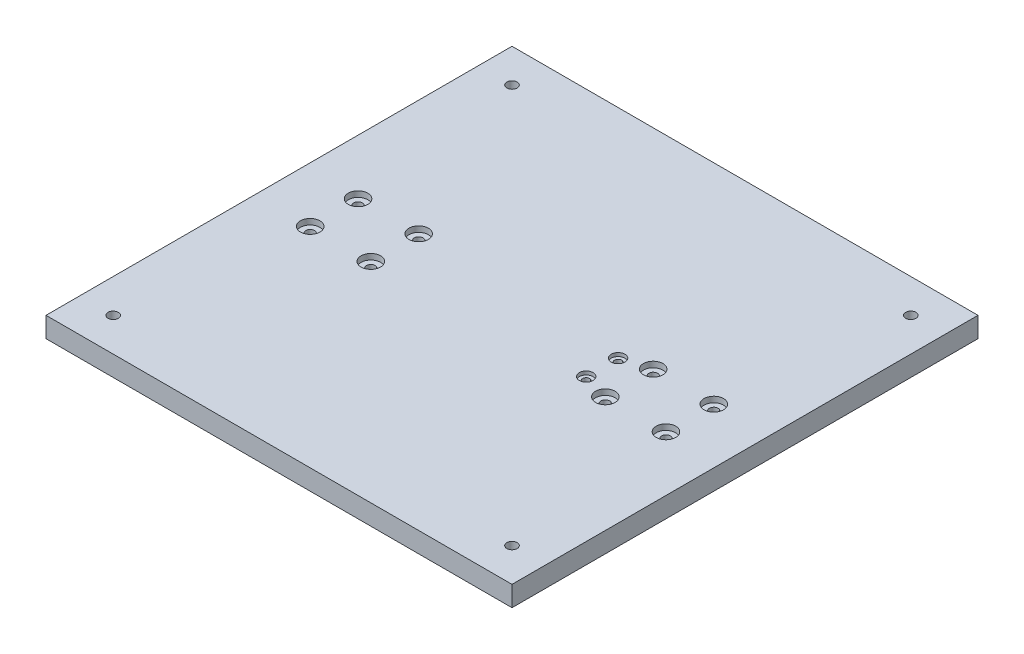
ISO-10303-21;
HEADER;
FILE_DESCRIPTION(('STEP AP214'),'2;1');
FILE_NAME('part.step','',(''),(''),'','','');
FILE_SCHEMA(('AUTOMOTIVE_DESIGN { 1 0 10303 214 1 1 1 1 }'));
ENDSEC;
DATA;
#1=APPLICATION_CONTEXT('core data for automotive mechanical design processes');
#2=APPLICATION_PROTOCOL_DEFINITION('international standard','automotive_design',2000,#1);
#3=PRODUCT_CONTEXT('',#1,'mechanical');
#4=PRODUCT('Part','Part','',(#3));
#5=PRODUCT_RELATED_PRODUCT_CATEGORY('part','',(#4));
#6=PRODUCT_DEFINITION_FORMATION('','',#4);
#7=PRODUCT_DEFINITION_CONTEXT('part definition',#1,'design');
#8=PRODUCT_DEFINITION('design','',#6,#7);
#9=PRODUCT_DEFINITION_SHAPE('','',#8);
#10=(LENGTH_UNIT() NAMED_UNIT(*) SI_UNIT(.MILLI.,.METRE.));
#11=(NAMED_UNIT(*) PLANE_ANGLE_UNIT() SI_UNIT($,.RADIAN.));
#12=(NAMED_UNIT(*) SI_UNIT($,.STERADIAN.) SOLID_ANGLE_UNIT());
#13=UNCERTAINTY_MEASURE_WITH_UNIT(LENGTH_MEASURE(1.E-05),#10,'distance_accuracy_value','');
#14=(GEOMETRIC_REPRESENTATION_CONTEXT(3) GLOBAL_UNCERTAINTY_ASSIGNED_CONTEXT((#13)) GLOBAL_UNIT_ASSIGNED_CONTEXT((#10,
#11,#12)) REPRESENTATION_CONTEXT('',''));
#15=CARTESIAN_POINT('',(0.,0.,0.));
#16=DIRECTION('',(0.,0.,1.));
#17=DIRECTION('',(1.,0.,0.));
#18=AXIS2_PLACEMENT_3D('',#15,#16,#17);
#19=CARTESIAN_POINT('',(0.,12.7,0.));
#20=DIRECTION('',(0.,-1.,0.));
#21=DIRECTION('',(0.,0.,-1.));
#22=AXIS2_PLACEMENT_3D('',#19,#20,#21);
#23=PLANE('',#22);
#24=CARTESIAN_POINT('',(56.5000014294171,12.7,-9.99999999999926));
#25=DIRECTION('',(0.,1.,0.));
#26=DIRECTION('',(0.,0.,1.));
#27=AXIS2_PLACEMENT_3D('',#24,#25,#26);
#28=CIRCLE('',#27,4.29999999999999);
#29=CARTESIAN_POINT('',(56.5000014294171,12.7,-5.69999999999927));
#30=VERTEX_POINT('',#29);
#31=EDGE_CURVE('E254',#30,#30,#28,.T.);
#32=ORIENTED_EDGE('',*,*,#31,.F.);
#33=EDGE_LOOP('',(#32));
#34=FACE_BOUND('',#33,.T.);
#35=CARTESIAN_POINT('',(56.5000014294171,12.7,10.0000005000007));
#36=DIRECTION('',(0.,1.,0.));
#37=DIRECTION('',(0.,0.,1.));
#38=AXIS2_PLACEMENT_3D('',#35,#36,#37);
#39=CIRCLE('',#38,4.29999999999999);
#40=CARTESIAN_POINT('',(56.5000014294171,12.7,14.3000005000007));
#41=VERTEX_POINT('',#40);
#42=EDGE_CURVE('E242',#41,#41,#39,.T.);
#43=ORIENTED_EDGE('',*,*,#42,.F.);
#44=EDGE_LOOP('',(#43));
#45=FACE_BOUND('',#44,.T.);
#46=CARTESIAN_POINT('',(111.5,12.7,-15.));
#47=DIRECTION('',(0.,1.,0.));
#48=DIRECTION('',(0.,0.,1.));
#49=AXIS2_PLACEMENT_3D('',#46,#47,#48);
#50=CIRCLE('',#49,6.12);
#51=CARTESIAN_POINT('',(111.5,12.7,-8.88));
#52=VERTEX_POINT('',#51);
#53=EDGE_CURVE('E218',#52,#52,#50,.T.);
#54=ORIENTED_EDGE('',*,*,#53,.F.);
#55=EDGE_LOOP('',(#54));
#56=FACE_BOUND('',#55,.T.);
#57=CARTESIAN_POINT('',(111.5,12.7,15.));
#58=DIRECTION('',(0.,1.,0.));
#59=DIRECTION('',(0.,0.,1.));
#60=AXIS2_PLACEMENT_3D('',#57,#58,#59);
#61=CIRCLE('',#60,6.12);
#62=CARTESIAN_POINT('',(111.5,12.7,21.12));
#63=VERTEX_POINT('',#62);
#64=EDGE_CURVE('E206',#63,#63,#61,.T.);
#65=ORIENTED_EDGE('',*,*,#64,.F.);
#66=EDGE_LOOP('',(#65));
#67=FACE_BOUND('',#66,.T.);
#68=CARTESIAN_POINT('',(73.5000000000001,12.7,-15.));
#69=DIRECTION('',(0.,1.,0.));
#70=DIRECTION('',(0.,0.,1.));
#71=AXIS2_PLACEMENT_3D('',#68,#69,#70);
#72=CIRCLE('',#71,6.12);
#73=CARTESIAN_POINT('',(73.5000000000001,12.7,-8.88));
#74=VERTEX_POINT('',#73);
#75=EDGE_CURVE('E194',#74,#74,#72,.T.);
#76=ORIENTED_EDGE('',*,*,#75,.F.);
#77=EDGE_LOOP('',(#76));
#78=FACE_BOUND('',#77,.T.);
#79=CARTESIAN_POINT('',(-73.5000000000001,12.7,15.));
#80=DIRECTION('',(0.,1.,0.));
#81=DIRECTION('',(0.,0.,1.));
#82=AXIS2_PLACEMENT_3D('',#79,#80,#81);
#83=CIRCLE('',#82,6.12);
#84=CARTESIAN_POINT('',(-73.5000000000001,12.7,21.12));
#85=VERTEX_POINT('',#84);
#86=EDGE_CURVE('E182',#85,#85,#83,.T.);
#87=ORIENTED_EDGE('',*,*,#86,.F.);
#88=EDGE_LOOP('',(#87));
#89=FACE_BOUND('',#88,.T.);
#90=CARTESIAN_POINT('',(-111.5,12.7,-15.));
#91=DIRECTION('',(0.,1.,0.));
#92=DIRECTION('',(0.,0.,1.));
#93=AXIS2_PLACEMENT_3D('',#90,#91,#92);
#94=CIRCLE('',#93,6.12);
#95=CARTESIAN_POINT('',(-111.5,12.7,-8.88));
#96=VERTEX_POINT('',#95);
#97=EDGE_CURVE('E170',#96,#96,#94,.T.);
#98=ORIENTED_EDGE('',*,*,#97,.F.);
#99=EDGE_LOOP('',(#98));
#100=FACE_BOUND('',#99,.T.);
#101=CARTESIAN_POINT('',(-111.5,12.7,15.));
#102=DIRECTION('',(0.,1.,0.));
#103=DIRECTION('',(0.,0.,1.));
#104=AXIS2_PLACEMENT_3D('',#101,#102,#103);
#105=CIRCLE('',#104,6.12);
#106=CARTESIAN_POINT('',(-111.5,12.7,21.12));
#107=VERTEX_POINT('',#106);
#108=EDGE_CURVE('E158',#107,#107,#105,.T.);
#109=ORIENTED_EDGE('',*,*,#108,.F.);
#110=EDGE_LOOP('',(#109));
#111=FACE_BOUND('',#110,.T.);
#112=CARTESIAN_POINT('',(-73.5000000000001,12.7,-15.));
#113=DIRECTION('',(0.,1.,0.));
#114=DIRECTION('',(0.,0.,1.));
#115=AXIS2_PLACEMENT_3D('',#112,#113,#114);
#116=CIRCLE('',#115,6.12);
#117=CARTESIAN_POINT('',(-73.5000000000001,12.7,-8.88));
#118=VERTEX_POINT('',#117);
#119=EDGE_CURVE('E146',#118,#118,#116,.T.);
#120=ORIENTED_EDGE('',*,*,#119,.F.);
#121=EDGE_LOOP('',(#120));
#122=FACE_BOUND('',#121,.T.);
#123=CARTESIAN_POINT('',(-125.,12.7,-125.));
#124=DIRECTION('',(0.,1.,0.));
#125=DIRECTION('',(0.,0.,1.));
#126=AXIS2_PLACEMENT_3D('',#123,#124,#125);
#127=CIRCLE('',#126,3.25);
#128=CARTESIAN_POINT('',(-125.,12.7,-121.75));
#129=VERTEX_POINT('',#128);
#130=EDGE_CURVE('E134',#129,#129,#127,.T.);
#131=ORIENTED_EDGE('',*,*,#130,.F.);
#132=EDGE_LOOP('',(#131));
#133=FACE_BOUND('',#132,.T.);
#134=CARTESIAN_POINT('',(125.,12.7,-125.));
#135=DIRECTION('',(0.,1.,0.));
#136=DIRECTION('',(0.,0.,1.));
#137=AXIS2_PLACEMENT_3D('',#134,#135,#136);
#138=CIRCLE('',#137,3.25);
#139=CARTESIAN_POINT('',(125.,12.7,-121.75));
#140=VERTEX_POINT('',#139);
#141=EDGE_CURVE('E128',#140,#140,#138,.T.);
#142=ORIENTED_EDGE('',*,*,#141,.F.);
#143=EDGE_LOOP('',(#142));
#144=FACE_BOUND('',#143,.T.);
#145=CARTESIAN_POINT('',(125.,12.7,125.));
#146=DIRECTION('',(0.,1.,0.));
#147=DIRECTION('',(0.,0.,1.));
#148=AXIS2_PLACEMENT_3D('',#145,#146,#147);
#149=CIRCLE('',#148,3.25);
#150=CARTESIAN_POINT('',(125.,12.7,128.25));
#151=VERTEX_POINT('',#150);
#152=EDGE_CURVE('E122',#151,#151,#149,.T.);
#153=ORIENTED_EDGE('',*,*,#152,.F.);
#154=EDGE_LOOP('',(#153));
#155=FACE_BOUND('',#154,.T.);
#156=CARTESIAN_POINT('',(-125.,12.7,125.));
#157=DIRECTION('',(0.,1.,0.));
#158=DIRECTION('',(0.,0.,1.));
#159=AXIS2_PLACEMENT_3D('',#156,#157,#158);
#160=CIRCLE('',#159,3.25);
#161=CARTESIAN_POINT('',(-125.,12.7,128.25));
#162=VERTEX_POINT('',#161);
#163=EDGE_CURVE('E116',#162,#162,#160,.T.);
#164=ORIENTED_EDGE('',*,*,#163,.F.);
#165=EDGE_LOOP('',(#164));
#166=FACE_BOUND('',#165,.T.);
#167=DIRECTION('',(0.,0.,-1.));
#168=VECTOR('',#167,1.);
#169=CARTESIAN_POINT('',(146.05,12.7,146.05));
#170=LINE('',#169,#168);
#171=CARTESIAN_POINT('',(146.05,12.7,146.05));
#172=VERTEX_POINT('',#171);
#173=CARTESIAN_POINT('',(146.05,12.7,-146.05));
#174=VERTEX_POINT('',#173);
#175=EDGE_CURVE('E87',#172,#174,#170,.T.);
#176=ORIENTED_EDGE('',*,*,#175,.T.);
#177=DIRECTION('',(-1.,0.,0.));
#178=VECTOR('',#177,1.);
#179=CARTESIAN_POINT('',(-146.05,12.7,-146.05));
#180=LINE('',#179,#178);
#181=CARTESIAN_POINT('',(-146.05,12.7,-146.05));
#182=VERTEX_POINT('',#181);
#183=EDGE_CURVE('E82',#174,#182,#180,.T.);
#184=ORIENTED_EDGE('',*,*,#183,.T.);
#185=DIRECTION('',(0.,0.,1.));
#186=VECTOR('',#185,1.);
#187=CARTESIAN_POINT('',(-146.05,12.7,146.05));
#188=LINE('',#187,#186);
#189=CARTESIAN_POINT('',(-146.05,12.7,146.05));
#190=VERTEX_POINT('',#189);
#191=EDGE_CURVE('E85',#182,#190,#188,.T.);
#192=ORIENTED_EDGE('',*,*,#191,.T.);
#193=DIRECTION('',(1.,0.,0.));
#194=VECTOR('',#193,1.);
#195=CARTESIAN_POINT('',(-146.05,12.7,146.05));
#196=LINE('',#195,#194);
#197=EDGE_CURVE('E52',#190,#172,#196,.T.);
#198=ORIENTED_EDGE('',*,*,#197,.T.);
#199=EDGE_LOOP('',(#176,#184,#192,#198));
#200=FACE_BOUND('',#199,.T.);
#201=CARTESIAN_POINT('',(73.5000000000001,12.7,15.));
#202=DIRECTION('',(0.,1.,0.));
#203=DIRECTION('',(0.,0.,1.));
#204=AXIS2_PLACEMENT_3D('',#201,#202,#203);
#205=CIRCLE('',#204,6.12);
#206=CARTESIAN_POINT('',(73.5000000000001,12.7,21.12));
#207=VERTEX_POINT('',#206);
#208=EDGE_CURVE('E230',#207,#207,#205,.T.);
#209=ORIENTED_EDGE('',*,*,#208,.F.);
#210=EDGE_LOOP('',(#209));
#211=FACE_BOUND('',#210,.T.);
#212=ADVANCED_FACE('F35',(#34,#45,#56,#67,#78,#89,#100,#111,#122,#133,#144,#155,#166,#200,#211),
#23,.F.);
#213=CARTESIAN_POINT('',(0.,0.,0.));
#214=DIRECTION('',(0.,-1.,0.));
#215=DIRECTION('',(0.,0.,-1.));
#216=AXIS2_PLACEMENT_3D('',#213,#214,#215);
#217=PLANE('',#216);
#218=CARTESIAN_POINT('',(56.5000014294171,0.,-9.99999999999926));
#219=DIRECTION('',(0.,1.,0.));
#220=DIRECTION('',(0.,0.,1.));
#221=AXIS2_PLACEMENT_3D('',#218,#219,#220);
#222=CIRCLE('',#221,2.25000000000001);
#223=CARTESIAN_POINT('',(56.5000014294171,0.,-7.74999999999925));
#224=VERTEX_POINT('',#223);
#225=EDGE_CURVE('E245',#224,#224,#222,.T.);
#226=ORIENTED_EDGE('',*,*,#225,.T.);
#227=EDGE_LOOP('',(#226));
#228=FACE_BOUND('',#227,.T.);
#229=CARTESIAN_POINT('',(56.5000014294171,0.,10.0000005000007));
#230=DIRECTION('',(0.,1.,0.));
#231=DIRECTION('',(0.,0.,1.));
#232=AXIS2_PLACEMENT_3D('',#229,#230,#231);
#233=CIRCLE('',#232,2.25000000000001);
#234=CARTESIAN_POINT('',(56.5000014294171,0.,12.2500005000007));
#235=VERTEX_POINT('',#234);
#236=EDGE_CURVE('E233',#235,#235,#233,.T.);
#237=ORIENTED_EDGE('',*,*,#236,.T.);
#238=EDGE_LOOP('',(#237));
#239=FACE_BOUND('',#238,.T.);
#240=CARTESIAN_POINT('',(111.5,0.,-15.));
#241=DIRECTION('',(0.,1.,0.));
#242=DIRECTION('',(0.,0.,1.));
#243=AXIS2_PLACEMENT_3D('',#240,#241,#242);
#244=CIRCLE('',#243,2.75);
#245=CARTESIAN_POINT('',(111.5,0.,-12.25));
#246=VERTEX_POINT('',#245);
#247=EDGE_CURVE('E209',#246,#246,#244,.T.);
#248=ORIENTED_EDGE('',*,*,#247,.T.);
#249=EDGE_LOOP('',(#248));
#250=FACE_BOUND('',#249,.T.);
#251=CARTESIAN_POINT('',(111.5,0.,15.));
#252=DIRECTION('',(0.,1.,0.));
#253=DIRECTION('',(0.,0.,1.));
#254=AXIS2_PLACEMENT_3D('',#251,#252,#253);
#255=CIRCLE('',#254,2.75);
#256=CARTESIAN_POINT('',(111.5,0.,17.75));
#257=VERTEX_POINT('',#256);
#258=EDGE_CURVE('E197',#257,#257,#255,.T.);
#259=ORIENTED_EDGE('',*,*,#258,.T.);
#260=EDGE_LOOP('',(#259));
#261=FACE_BOUND('',#260,.T.);
#262=CARTESIAN_POINT('',(73.5000000000001,0.,-15.));
#263=DIRECTION('',(0.,1.,0.));
#264=DIRECTION('',(0.,0.,1.));
#265=AXIS2_PLACEMENT_3D('',#262,#263,#264);
#266=CIRCLE('',#265,2.75);
#267=CARTESIAN_POINT('',(73.5000000000001,0.,-12.25));
#268=VERTEX_POINT('',#267);
#269=EDGE_CURVE('E185',#268,#268,#266,.T.);
#270=ORIENTED_EDGE('',*,*,#269,.T.);
#271=EDGE_LOOP('',(#270));
#272=FACE_BOUND('',#271,.T.);
#273=CARTESIAN_POINT('',(-73.5000000000001,0.,15.));
#274=DIRECTION('',(0.,1.,0.));
#275=DIRECTION('',(0.,0.,1.));
#276=AXIS2_PLACEMENT_3D('',#273,#274,#275);
#277=CIRCLE('',#276,2.75);
#278=CARTESIAN_POINT('',(-73.5000000000001,0.,17.75));
#279=VERTEX_POINT('',#278);
#280=EDGE_CURVE('E173',#279,#279,#277,.T.);
#281=ORIENTED_EDGE('',*,*,#280,.T.);
#282=EDGE_LOOP('',(#281));
#283=FACE_BOUND('',#282,.T.);
#284=CARTESIAN_POINT('',(-111.5,0.,-15.));
#285=DIRECTION('',(0.,1.,0.));
#286=DIRECTION('',(0.,0.,1.));
#287=AXIS2_PLACEMENT_3D('',#284,#285,#286);
#288=CIRCLE('',#287,2.75);
#289=CARTESIAN_POINT('',(-111.5,0.,-12.25));
#290=VERTEX_POINT('',#289);
#291=EDGE_CURVE('E161',#290,#290,#288,.T.);
#292=ORIENTED_EDGE('',*,*,#291,.T.);
#293=EDGE_LOOP('',(#292));
#294=FACE_BOUND('',#293,.T.);
#295=CARTESIAN_POINT('',(-111.5,0.,15.));
#296=DIRECTION('',(0.,1.,0.));
#297=DIRECTION('',(0.,0.,1.));
#298=AXIS2_PLACEMENT_3D('',#295,#296,#297);
#299=CIRCLE('',#298,2.75);
#300=CARTESIAN_POINT('',(-111.5,0.,17.75));
#301=VERTEX_POINT('',#300);
#302=EDGE_CURVE('E149',#301,#301,#299,.T.);
#303=ORIENTED_EDGE('',*,*,#302,.T.);
#304=EDGE_LOOP('',(#303));
#305=FACE_BOUND('',#304,.T.);
#306=CARTESIAN_POINT('',(-73.5000000000001,0.,-15.));
#307=DIRECTION('',(0.,1.,0.));
#308=DIRECTION('',(0.,0.,1.));
#309=AXIS2_PLACEMENT_3D('',#306,#307,#308);
#310=CIRCLE('',#309,2.75);
#311=CARTESIAN_POINT('',(-73.5000000000001,0.,-12.25));
#312=VERTEX_POINT('',#311);
#313=EDGE_CURVE('E137',#312,#312,#310,.T.);
#314=ORIENTED_EDGE('',*,*,#313,.T.);
#315=EDGE_LOOP('',(#314));
#316=FACE_BOUND('',#315,.T.);
#317=CARTESIAN_POINT('',(-125.,0.,-125.));
#318=DIRECTION('',(0.,1.,0.));
#319=DIRECTION('',(0.,0.,1.));
#320=AXIS2_PLACEMENT_3D('',#317,#318,#319);
#321=CIRCLE('',#320,3.25);
#322=CARTESIAN_POINT('',(-125.,0.,-121.75));
#323=VERTEX_POINT('',#322);
#324=EDGE_CURVE('E131',#323,#323,#321,.T.);
#325=ORIENTED_EDGE('',*,*,#324,.T.);
#326=EDGE_LOOP('',(#325));
#327=FACE_BOUND('',#326,.T.);
#328=CARTESIAN_POINT('',(125.,0.,-125.));
#329=DIRECTION('',(0.,1.,0.));
#330=DIRECTION('',(0.,0.,1.));
#331=AXIS2_PLACEMENT_3D('',#328,#329,#330);
#332=CIRCLE('',#331,3.25);
#333=CARTESIAN_POINT('',(125.,0.,-121.75));
#334=VERTEX_POINT('',#333);
#335=EDGE_CURVE('E125',#334,#334,#332,.T.);
#336=ORIENTED_EDGE('',*,*,#335,.T.);
#337=EDGE_LOOP('',(#336));
#338=FACE_BOUND('',#337,.T.);
#339=CARTESIAN_POINT('',(125.,0.,125.));
#340=DIRECTION('',(0.,1.,0.));
#341=DIRECTION('',(0.,0.,1.));
#342=AXIS2_PLACEMENT_3D('',#339,#340,#341);
#343=CIRCLE('',#342,3.25);
#344=CARTESIAN_POINT('',(125.,0.,128.25));
#345=VERTEX_POINT('',#344);
#346=EDGE_CURVE('E119',#345,#345,#343,.T.);
#347=ORIENTED_EDGE('',*,*,#346,.T.);
#348=EDGE_LOOP('',(#347));
#349=FACE_BOUND('',#348,.T.);
#350=CARTESIAN_POINT('',(-125.,0.,125.));
#351=DIRECTION('',(0.,1.,0.));
#352=DIRECTION('',(0.,0.,1.));
#353=AXIS2_PLACEMENT_3D('',#350,#351,#352);
#354=CIRCLE('',#353,3.25);
#355=CARTESIAN_POINT('',(-125.,0.,128.25));
#356=VERTEX_POINT('',#355);
#357=EDGE_CURVE('E102',#356,#356,#354,.T.);
#358=ORIENTED_EDGE('',*,*,#357,.T.);
#359=EDGE_LOOP('',(#358));
#360=FACE_BOUND('',#359,.T.);
#361=DIRECTION('',(0.,0.,-1.));
#362=VECTOR('',#361,1.);
#363=CARTESIAN_POINT('',(146.05,0.,146.05));
#364=LINE('',#363,#362);
#365=CARTESIAN_POINT('',(146.05,0.,146.05));
#366=VERTEX_POINT('',#365);
#367=CARTESIAN_POINT('',(146.05,0.,-146.05));
#368=VERTEX_POINT('',#367);
#369=EDGE_CURVE('E99',#366,#368,#364,.T.);
#370=ORIENTED_EDGE('',*,*,#369,.F.);
#371=DIRECTION('',(1.,0.,0.));
#372=VECTOR('',#371,1.);
#373=CARTESIAN_POINT('',(-146.05,0.,146.05));
#374=LINE('',#373,#372);
#375=CARTESIAN_POINT('',(-146.05,0.,146.05));
#376=VERTEX_POINT('',#375);
#377=EDGE_CURVE('E75',#376,#366,#374,.T.);
#378=ORIENTED_EDGE('',*,*,#377,.F.);
#379=DIRECTION('',(0.,0.,1.));
#380=VECTOR('',#379,1.);
#381=CARTESIAN_POINT('',(-146.05,0.,146.05));
#382=LINE('',#381,#380);
#383=CARTESIAN_POINT('',(-146.05,0.,-146.05));
#384=VERTEX_POINT('',#383);
#385=EDGE_CURVE('E69',#384,#376,#382,.T.);
#386=ORIENTED_EDGE('',*,*,#385,.F.);
#387=DIRECTION('',(-1.,0.,0.));
#388=VECTOR('',#387,1.);
#389=CARTESIAN_POINT('',(-146.05,0.,-146.05));
#390=LINE('',#389,#388);
#391=EDGE_CURVE('E91',#368,#384,#390,.T.);
#392=ORIENTED_EDGE('',*,*,#391,.F.);
#393=EDGE_LOOP('',(#370,#378,#386,#392));
#394=FACE_BOUND('',#393,.T.);
#395=CARTESIAN_POINT('',(73.5000000000001,0.,15.));
#396=DIRECTION('',(0.,1.,0.));
#397=DIRECTION('',(0.,0.,1.));
#398=AXIS2_PLACEMENT_3D('',#395,#396,#397);
#399=CIRCLE('',#398,2.75);
#400=CARTESIAN_POINT('',(73.5000000000001,0.,17.75));
#401=VERTEX_POINT('',#400);
#402=EDGE_CURVE('E221',#401,#401,#399,.T.);
#403=ORIENTED_EDGE('',*,*,#402,.T.);
#404=EDGE_LOOP('',(#403));
#405=FACE_BOUND('',#404,.T.);
#406=ADVANCED_FACE('F110',(#228,#239,#250,#261,#272,#283,#294,#305,#316,#327,#338,#349,#360,
#394,#405),#217,.T.);
#407=CARTESIAN_POINT('',(146.05,12.7,146.05));
#408=DIRECTION('',(-1.,0.,0.));
#409=DIRECTION('',(0.,0.,1.));
#410=AXIS2_PLACEMENT_3D('',#407,#408,#409);
#411=PLANE('',#410);
#412=ORIENTED_EDGE('',*,*,#369,.T.);
#413=DIRECTION('',(0.,-1.,0.));
#414=VECTOR('',#413,1.);
#415=CARTESIAN_POINT('',(146.05,12.7,-146.05));
#416=LINE('',#415,#414);
#417=EDGE_CURVE('E11',#174,#368,#416,.T.);
#418=ORIENTED_EDGE('',*,*,#417,.F.);
#419=ORIENTED_EDGE('',*,*,#175,.F.);
#420=DIRECTION('',(0.,-1.,0.));
#421=VECTOR('',#420,1.);
#422=CARTESIAN_POINT('',(146.05,12.7,146.05));
#423=LINE('',#422,#421);
#424=EDGE_CURVE('E95',#172,#366,#423,.T.);
#425=ORIENTED_EDGE('',*,*,#424,.T.);
#426=EDGE_LOOP('',(#412,#418,#419,#425));
#427=FACE_BOUND('',#426,.T.);
#428=ADVANCED_FACE('F37',(#427),#411,.F.);
#429=CARTESIAN_POINT('',(-146.05,12.7,-146.05));
#430=DIRECTION('',(0.,0.,1.));
#431=DIRECTION('',(1.,0.,0.));
#432=AXIS2_PLACEMENT_3D('',#429,#430,#431);
#433=PLANE('',#432);
#434=ORIENTED_EDGE('',*,*,#391,.T.);
#435=DIRECTION('',(0.,-1.,0.));
#436=VECTOR('',#435,1.);
#437=CARTESIAN_POINT('',(-146.05,12.7,-146.05));
#438=LINE('',#437,#436);
#439=EDGE_CURVE('E44',#182,#384,#438,.T.);
#440=ORIENTED_EDGE('',*,*,#439,.F.);
#441=ORIENTED_EDGE('',*,*,#183,.F.);
#442=ORIENTED_EDGE('',*,*,#417,.T.);
#443=EDGE_LOOP('',(#434,#440,#441,#442));
#444=FACE_BOUND('',#443,.T.);
#445=ADVANCED_FACE('F90',(#444),#433,.F.);
#446=CARTESIAN_POINT('',(-146.05,12.7,146.05));
#447=DIRECTION('',(1.,0.,0.));
#448=DIRECTION('',(0.,0.,-1.));
#449=AXIS2_PLACEMENT_3D('',#446,#447,#448);
#450=PLANE('',#449);
#451=ORIENTED_EDGE('',*,*,#385,.T.);
#452=DIRECTION('',(0.,-1.,0.));
#453=VECTOR('',#452,1.);
#454=CARTESIAN_POINT('',(-146.05,12.7,146.05));
#455=LINE('',#454,#453);
#456=EDGE_CURVE('E92',#190,#376,#455,.T.);
#457=ORIENTED_EDGE('',*,*,#456,.F.);
#458=ORIENTED_EDGE('',*,*,#191,.F.);
#459=ORIENTED_EDGE('',*,*,#439,.T.);
#460=EDGE_LOOP('',(#451,#457,#458,#459));
#461=FACE_BOUND('',#460,.T.);
#462=ADVANCED_FACE('F93',(#461),#450,.F.);
#463=CARTESIAN_POINT('',(-146.05,12.7,146.05));
#464=DIRECTION('',(0.,0.,-1.));
#465=DIRECTION('',(-1.,0.,0.));
#466=AXIS2_PLACEMENT_3D('',#463,#464,#465);
#467=PLANE('',#466);
#468=ORIENTED_EDGE('',*,*,#377,.T.);
#469=ORIENTED_EDGE('',*,*,#424,.F.);
#470=ORIENTED_EDGE('',*,*,#197,.F.);
#471=ORIENTED_EDGE('',*,*,#456,.T.);
#472=EDGE_LOOP('',(#468,#469,#470,#471));
#473=FACE_BOUND('',#472,.T.);
#474=ADVANCED_FACE('F107',(#473),#467,.F.);
#475=CARTESIAN_POINT('',(-125.,12.7,125.));
#476=DIRECTION('',(0.,1.,0.));
#477=DIRECTION('',(0.,0.,1.));
#478=AXIS2_PLACEMENT_3D('',#475,#476,#477);
#479=CYLINDRICAL_SURFACE('',#478,3.25);
#480=ORIENTED_EDGE('',*,*,#357,.F.);
#481=EDGE_LOOP('',(#480));
#482=FACE_BOUND('',#481,.T.);
#483=ORIENTED_EDGE('',*,*,#163,.T.);
#484=EDGE_LOOP('',(#483));
#485=FACE_BOUND('',#484,.T.);
#486=ADVANCED_FACE('F287',(#482,#485),#479,.F.);
#487=CARTESIAN_POINT('',(125.,12.7,125.));
#488=DIRECTION('',(0.,1.,0.));
#489=DIRECTION('',(0.,0.,1.));
#490=AXIS2_PLACEMENT_3D('',#487,#488,#489);
#491=CYLINDRICAL_SURFACE('',#490,3.25);
#492=ORIENTED_EDGE('',*,*,#346,.F.);
#493=EDGE_LOOP('',(#492));
#494=FACE_BOUND('',#493,.T.);
#495=ORIENTED_EDGE('',*,*,#152,.T.);
#496=EDGE_LOOP('',(#495));
#497=FACE_BOUND('',#496,.T.);
#498=ADVANCED_FACE('F289',(#494,#497),#491,.F.);
#499=CARTESIAN_POINT('',(125.,12.7,-125.));
#500=DIRECTION('',(0.,1.,0.));
#501=DIRECTION('',(0.,0.,1.));
#502=AXIS2_PLACEMENT_3D('',#499,#500,#501);
#503=CYLINDRICAL_SURFACE('',#502,3.25);
#504=ORIENTED_EDGE('',*,*,#335,.F.);
#505=EDGE_LOOP('',(#504));
#506=FACE_BOUND('',#505,.T.);
#507=ORIENTED_EDGE('',*,*,#141,.T.);
#508=EDGE_LOOP('',(#507));
#509=FACE_BOUND('',#508,.T.);
#510=ADVANCED_FACE('F296',(#506,#509),#503,.F.);
#511=CARTESIAN_POINT('',(-125.,12.7,-125.));
#512=DIRECTION('',(0.,1.,0.));
#513=DIRECTION('',(0.,0.,1.));
#514=AXIS2_PLACEMENT_3D('',#511,#512,#513);
#515=CYLINDRICAL_SURFACE('',#514,3.25);
#516=ORIENTED_EDGE('',*,*,#324,.F.);
#517=EDGE_LOOP('',(#516));
#518=FACE_BOUND('',#517,.T.);
#519=ORIENTED_EDGE('',*,*,#130,.T.);
#520=EDGE_LOOP('',(#519));
#521=FACE_BOUND('',#520,.T.);
#522=ADVANCED_FACE('F565',(#518,#521),#515,.F.);
#523=CARTESIAN_POINT('',(-73.5000000000001,12.7,-15.));
#524=DIRECTION('',(0.,1.,0.));
#525=DIRECTION('',(0.,0.,1.));
#526=AXIS2_PLACEMENT_3D('',#523,#524,#525);
#527=CYLINDRICAL_SURFACE('',#526,2.75);
#528=ORIENTED_EDGE('',*,*,#313,.F.);
#529=EDGE_LOOP('',(#528));
#530=FACE_BOUND('',#529,.T.);
#531=CARTESIAN_POINT('',(-73.5000000000001,9.12,-15.));
#532=DIRECTION('',(0.,1.,0.));
#533=DIRECTION('',(0.,0.,1.));
#534=AXIS2_PLACEMENT_3D('',#531,#532,#533);
#535=CIRCLE('',#534,2.75);
#536=CARTESIAN_POINT('',(-73.5000000000001,9.12,-12.25));
#537=VERTEX_POINT('',#536);
#538=EDGE_CURVE('E140',#537,#537,#535,.T.);
#539=ORIENTED_EDGE('',*,*,#538,.T.);
#540=EDGE_LOOP('',(#539));
#541=FACE_BOUND('',#540,.T.);
#542=ADVANCED_FACE('F555',(#530,#541),#527,.F.);
#543=CARTESIAN_POINT('',(-70.7500000000001,9.12,-15.));
#544=DIRECTION('',(0.,-1.,0.));
#545=DIRECTION('',(0.,0.,-1.));
#546=AXIS2_PLACEMENT_3D('',#543,#544,#545);
#547=PLANE('',#546);
#548=ORIENTED_EDGE('',*,*,#538,.F.);
#549=EDGE_LOOP('',(#548));
#550=FACE_BOUND('',#549,.T.);
#551=CARTESIAN_POINT('',(-73.5000000000001,9.12,-15.));
#552=DIRECTION('',(0.,1.,0.));
#553=DIRECTION('',(0.,0.,1.));
#554=AXIS2_PLACEMENT_3D('',#551,#552,#553);
#555=CIRCLE('',#554,6.12);
#556=CARTESIAN_POINT('',(-73.5000000000001,9.12,-8.88));
#557=VERTEX_POINT('',#556);
#558=EDGE_CURVE('E143',#557,#557,#555,.T.);
#559=ORIENTED_EDGE('',*,*,#558,.T.);
#560=EDGE_LOOP('',(#559));
#561=FACE_BOUND('',#560,.T.);
#562=ADVANCED_FACE('F545',(#550,#561),#547,.F.);
#563=CARTESIAN_POINT('',(-73.5000000000001,12.7,-15.));
#564=DIRECTION('',(0.,1.,0.));
#565=DIRECTION('',(0.,0.,1.));
#566=AXIS2_PLACEMENT_3D('',#563,#564,#565);
#567=CYLINDRICAL_SURFACE('',#566,6.12);
#568=ORIENTED_EDGE('',*,*,#558,.F.);
#569=EDGE_LOOP('',(#568));
#570=FACE_BOUND('',#569,.T.);
#571=ORIENTED_EDGE('',*,*,#119,.T.);
#572=EDGE_LOOP('',(#571));
#573=FACE_BOUND('',#572,.T.);
#574=ADVANCED_FACE('F535',(#570,#573),#567,.F.);
#575=CARTESIAN_POINT('',(-111.5,12.7,15.));
#576=DIRECTION('',(0.,1.,0.));
#577=DIRECTION('',(0.,0.,1.));
#578=AXIS2_PLACEMENT_3D('',#575,#576,#577);
#579=CYLINDRICAL_SURFACE('',#578,2.75);
#580=ORIENTED_EDGE('',*,*,#302,.F.);
#581=EDGE_LOOP('',(#580));
#582=FACE_BOUND('',#581,.T.);
#583=CARTESIAN_POINT('',(-111.5,9.12,15.));
#584=DIRECTION('',(0.,1.,0.));
#585=DIRECTION('',(0.,0.,1.));
#586=AXIS2_PLACEMENT_3D('',#583,#584,#585);
#587=CIRCLE('',#586,2.75);
#588=CARTESIAN_POINT('',(-111.5,9.12,17.75));
#589=VERTEX_POINT('',#588);
#590=EDGE_CURVE('E152',#589,#589,#587,.T.);
#591=ORIENTED_EDGE('',*,*,#590,.T.);
#592=EDGE_LOOP('',(#591));
#593=FACE_BOUND('',#592,.T.);
#594=ADVANCED_FACE('F525',(#582,#593),#579,.F.);
#595=CARTESIAN_POINT('',(-108.75,9.12,15.));
#596=DIRECTION('',(0.,-1.,0.));
#597=DIRECTION('',(0.,0.,-1.));
#598=AXIS2_PLACEMENT_3D('',#595,#596,#597);
#599=PLANE('',#598);
#600=ORIENTED_EDGE('',*,*,#590,.F.);
#601=EDGE_LOOP('',(#600));
#602=FACE_BOUND('',#601,.T.);
#603=CARTESIAN_POINT('',(-111.5,9.12,15.));
#604=DIRECTION('',(0.,1.,0.));
#605=DIRECTION('',(0.,0.,1.));
#606=AXIS2_PLACEMENT_3D('',#603,#604,#605);
#607=CIRCLE('',#606,6.12);
#608=CARTESIAN_POINT('',(-111.5,9.12,21.12));
#609=VERTEX_POINT('',#608);
#610=EDGE_CURVE('E155',#609,#609,#607,.T.);
#611=ORIENTED_EDGE('',*,*,#610,.T.);
#612=EDGE_LOOP('',(#611));
#613=FACE_BOUND('',#612,.T.);
#614=ADVANCED_FACE('F515',(#602,#613),#599,.F.);
#615=CARTESIAN_POINT('',(-111.5,12.7,15.));
#616=DIRECTION('',(0.,1.,0.));
#617=DIRECTION('',(0.,0.,1.));
#618=AXIS2_PLACEMENT_3D('',#615,#616,#617);
#619=CYLINDRICAL_SURFACE('',#618,6.12);
#620=ORIENTED_EDGE('',*,*,#610,.F.);
#621=EDGE_LOOP('',(#620));
#622=FACE_BOUND('',#621,.T.);
#623=ORIENTED_EDGE('',*,*,#108,.T.);
#624=EDGE_LOOP('',(#623));
#625=FACE_BOUND('',#624,.T.);
#626=ADVANCED_FACE('F505',(#622,#625),#619,.F.);
#627=CARTESIAN_POINT('',(-111.5,12.7,-15.));
#628=DIRECTION('',(0.,1.,0.));
#629=DIRECTION('',(0.,0.,1.));
#630=AXIS2_PLACEMENT_3D('',#627,#628,#629);
#631=CYLINDRICAL_SURFACE('',#630,2.75);
#632=ORIENTED_EDGE('',*,*,#291,.F.);
#633=EDGE_LOOP('',(#632));
#634=FACE_BOUND('',#633,.T.);
#635=CARTESIAN_POINT('',(-111.5,9.12,-15.));
#636=DIRECTION('',(0.,1.,0.));
#637=DIRECTION('',(0.,0.,1.));
#638=AXIS2_PLACEMENT_3D('',#635,#636,#637);
#639=CIRCLE('',#638,2.75);
#640=CARTESIAN_POINT('',(-111.5,9.12,-12.25));
#641=VERTEX_POINT('',#640);
#642=EDGE_CURVE('E164',#641,#641,#639,.T.);
#643=ORIENTED_EDGE('',*,*,#642,.T.);
#644=EDGE_LOOP('',(#643));
#645=FACE_BOUND('',#644,.T.);
#646=ADVANCED_FACE('F495',(#634,#645),#631,.F.);
#647=CARTESIAN_POINT('',(-108.75,9.12,-15.));
#648=DIRECTION('',(0.,-1.,0.));
#649=DIRECTION('',(0.,0.,-1.));
#650=AXIS2_PLACEMENT_3D('',#647,#648,#649);
#651=PLANE('',#650);
#652=ORIENTED_EDGE('',*,*,#642,.F.);
#653=EDGE_LOOP('',(#652));
#654=FACE_BOUND('',#653,.T.);
#655=CARTESIAN_POINT('',(-111.5,9.12,-15.));
#656=DIRECTION('',(0.,1.,0.));
#657=DIRECTION('',(0.,0.,1.));
#658=AXIS2_PLACEMENT_3D('',#655,#656,#657);
#659=CIRCLE('',#658,6.12);
#660=CARTESIAN_POINT('',(-111.5,9.12,-8.88));
#661=VERTEX_POINT('',#660);
#662=EDGE_CURVE('E167',#661,#661,#659,.T.);
#663=ORIENTED_EDGE('',*,*,#662,.T.);
#664=EDGE_LOOP('',(#663));
#665=FACE_BOUND('',#664,.T.);
#666=ADVANCED_FACE('F485',(#654,#665),#651,.F.);
#667=CARTESIAN_POINT('',(-111.5,12.7,-15.));
#668=DIRECTION('',(0.,1.,0.));
#669=DIRECTION('',(0.,0.,1.));
#670=AXIS2_PLACEMENT_3D('',#667,#668,#669);
#671=CYLINDRICAL_SURFACE('',#670,6.12);
#672=ORIENTED_EDGE('',*,*,#662,.F.);
#673=EDGE_LOOP('',(#672));
#674=FACE_BOUND('',#673,.T.);
#675=ORIENTED_EDGE('',*,*,#97,.T.);
#676=EDGE_LOOP('',(#675));
#677=FACE_BOUND('',#676,.T.);
#678=ADVANCED_FACE('F475',(#674,#677),#671,.F.);
#679=CARTESIAN_POINT('',(-73.5000000000001,12.7,15.));
#680=DIRECTION('',(0.,1.,0.));
#681=DIRECTION('',(0.,0.,1.));
#682=AXIS2_PLACEMENT_3D('',#679,#680,#681);
#683=CYLINDRICAL_SURFACE('',#682,2.75);
#684=ORIENTED_EDGE('',*,*,#280,.F.);
#685=EDGE_LOOP('',(#684));
#686=FACE_BOUND('',#685,.T.);
#687=CARTESIAN_POINT('',(-73.5000000000001,9.12,15.));
#688=DIRECTION('',(0.,1.,0.));
#689=DIRECTION('',(0.,0.,1.));
#690=AXIS2_PLACEMENT_3D('',#687,#688,#689);
#691=CIRCLE('',#690,2.75);
#692=CARTESIAN_POINT('',(-73.5000000000001,9.12,17.75));
#693=VERTEX_POINT('',#692);
#694=EDGE_CURVE('E176',#693,#693,#691,.T.);
#695=ORIENTED_EDGE('',*,*,#694,.T.);
#696=EDGE_LOOP('',(#695));
#697=FACE_BOUND('',#696,.T.);
#698=ADVANCED_FACE('F465',(#686,#697),#683,.F.);
#699=CARTESIAN_POINT('',(-70.7500000000001,9.12,15.));
#700=DIRECTION('',(0.,-1.,0.));
#701=DIRECTION('',(0.,0.,-1.));
#702=AXIS2_PLACEMENT_3D('',#699,#700,#701);
#703=PLANE('',#702);
#704=ORIENTED_EDGE('',*,*,#694,.F.);
#705=EDGE_LOOP('',(#704));
#706=FACE_BOUND('',#705,.T.);
#707=CARTESIAN_POINT('',(-73.5000000000001,9.12,15.));
#708=DIRECTION('',(0.,1.,0.));
#709=DIRECTION('',(0.,0.,1.));
#710=AXIS2_PLACEMENT_3D('',#707,#708,#709);
#711=CIRCLE('',#710,6.12);
#712=CARTESIAN_POINT('',(-73.5000000000001,9.12,21.12));
#713=VERTEX_POINT('',#712);
#714=EDGE_CURVE('E179',#713,#713,#711,.T.);
#715=ORIENTED_EDGE('',*,*,#714,.T.);
#716=EDGE_LOOP('',(#715));
#717=FACE_BOUND('',#716,.T.);
#718=ADVANCED_FACE('F455',(#706,#717),#703,.F.);
#719=CARTESIAN_POINT('',(-73.5000000000001,12.7,15.));
#720=DIRECTION('',(0.,1.,0.));
#721=DIRECTION('',(0.,0.,1.));
#722=AXIS2_PLACEMENT_3D('',#719,#720,#721);
#723=CYLINDRICAL_SURFACE('',#722,6.12);
#724=ORIENTED_EDGE('',*,*,#714,.F.);
#725=EDGE_LOOP('',(#724));
#726=FACE_BOUND('',#725,.T.);
#727=ORIENTED_EDGE('',*,*,#86,.T.);
#728=EDGE_LOOP('',(#727));
#729=FACE_BOUND('',#728,.T.);
#730=ADVANCED_FACE('F445',(#726,#729),#723,.F.);
#731=CARTESIAN_POINT('',(73.5000000000001,12.7,-15.));
#732=DIRECTION('',(0.,1.,0.));
#733=DIRECTION('',(0.,0.,1.));
#734=AXIS2_PLACEMENT_3D('',#731,#732,#733);
#735=CYLINDRICAL_SURFACE('',#734,2.75);
#736=ORIENTED_EDGE('',*,*,#269,.F.);
#737=EDGE_LOOP('',(#736));
#738=FACE_BOUND('',#737,.T.);
#739=CARTESIAN_POINT('',(73.5000000000001,9.12,-15.));
#740=DIRECTION('',(0.,1.,0.));
#741=DIRECTION('',(0.,0.,1.));
#742=AXIS2_PLACEMENT_3D('',#739,#740,#741);
#743=CIRCLE('',#742,2.75);
#744=CARTESIAN_POINT('',(73.5000000000001,9.12,-12.25));
#745=VERTEX_POINT('',#744);
#746=EDGE_CURVE('E188',#745,#745,#743,.T.);
#747=ORIENTED_EDGE('',*,*,#746,.T.);
#748=EDGE_LOOP('',(#747));
#749=FACE_BOUND('',#748,.T.);
#750=ADVANCED_FACE('F436',(#738,#749),#735,.F.);
#751=CARTESIAN_POINT('',(76.2500000000001,9.12,-15.));
#752=DIRECTION('',(0.,-1.,0.));
#753=DIRECTION('',(0.,0.,-1.));
#754=AXIS2_PLACEMENT_3D('',#751,#752,#753);
#755=PLANE('',#754);
#756=ORIENTED_EDGE('',*,*,#746,.F.);
#757=EDGE_LOOP('',(#756));
#758=FACE_BOUND('',#757,.T.);
#759=CARTESIAN_POINT('',(73.5000000000001,9.12,-15.));
#760=DIRECTION('',(0.,1.,0.));
#761=DIRECTION('',(0.,0.,1.));
#762=AXIS2_PLACEMENT_3D('',#759,#760,#761);
#763=CIRCLE('',#762,6.12);
#764=CARTESIAN_POINT('',(73.5000000000001,9.12,-8.88));
#765=VERTEX_POINT('',#764);
#766=EDGE_CURVE('E191',#765,#765,#763,.T.);
#767=ORIENTED_EDGE('',*,*,#766,.T.);
#768=EDGE_LOOP('',(#767));
#769=FACE_BOUND('',#768,.T.);
#770=ADVANCED_FACE('F426',(#758,#769),#755,.F.);
#771=CARTESIAN_POINT('',(73.5000000000001,12.7,-15.));
#772=DIRECTION('',(0.,1.,0.));
#773=DIRECTION('',(0.,0.,1.));
#774=AXIS2_PLACEMENT_3D('',#771,#772,#773);
#775=CYLINDRICAL_SURFACE('',#774,6.12);
#776=ORIENTED_EDGE('',*,*,#766,.F.);
#777=EDGE_LOOP('',(#776));
#778=FACE_BOUND('',#777,.T.);
#779=ORIENTED_EDGE('',*,*,#75,.T.);
#780=EDGE_LOOP('',(#779));
#781=FACE_BOUND('',#780,.T.);
#782=ADVANCED_FACE('F416',(#778,#781),#775,.F.);
#783=CARTESIAN_POINT('',(111.5,12.7,15.));
#784=DIRECTION('',(0.,1.,0.));
#785=DIRECTION('',(0.,0.,1.));
#786=AXIS2_PLACEMENT_3D('',#783,#784,#785);
#787=CYLINDRICAL_SURFACE('',#786,2.75);
#788=ORIENTED_EDGE('',*,*,#258,.F.);
#789=EDGE_LOOP('',(#788));
#790=FACE_BOUND('',#789,.T.);
#791=CARTESIAN_POINT('',(111.5,9.12,15.));
#792=DIRECTION('',(0.,1.,0.));
#793=DIRECTION('',(0.,0.,1.));
#794=AXIS2_PLACEMENT_3D('',#791,#792,#793);
#795=CIRCLE('',#794,2.75);
#796=CARTESIAN_POINT('',(111.5,9.12,17.75));
#797=VERTEX_POINT('',#796);
#798=EDGE_CURVE('E200',#797,#797,#795,.T.);
#799=ORIENTED_EDGE('',*,*,#798,.T.);
#800=EDGE_LOOP('',(#799));
#801=FACE_BOUND('',#800,.T.);
#802=ADVANCED_FACE('F406',(#790,#801),#787,.F.);
#803=CARTESIAN_POINT('',(114.25,9.12,15.));
#804=DIRECTION('',(0.,-1.,0.));
#805=DIRECTION('',(0.,0.,-1.));
#806=AXIS2_PLACEMENT_3D('',#803,#804,#805);
#807=PLANE('',#806);
#808=ORIENTED_EDGE('',*,*,#798,.F.);
#809=EDGE_LOOP('',(#808));
#810=FACE_BOUND('',#809,.T.);
#811=CARTESIAN_POINT('',(111.5,9.12,15.));
#812=DIRECTION('',(0.,1.,0.));
#813=DIRECTION('',(0.,0.,1.));
#814=AXIS2_PLACEMENT_3D('',#811,#812,#813);
#815=CIRCLE('',#814,6.12);
#816=CARTESIAN_POINT('',(111.5,9.12,21.12));
#817=VERTEX_POINT('',#816);
#818=EDGE_CURVE('E203',#817,#817,#815,.T.);
#819=ORIENTED_EDGE('',*,*,#818,.T.);
#820=EDGE_LOOP('',(#819));
#821=FACE_BOUND('',#820,.T.);
#822=ADVANCED_FACE('F396',(#810,#821),#807,.F.);
#823=CARTESIAN_POINT('',(111.5,12.7,15.));
#824=DIRECTION('',(0.,1.,0.));
#825=DIRECTION('',(0.,0.,1.));
#826=AXIS2_PLACEMENT_3D('',#823,#824,#825);
#827=CYLINDRICAL_SURFACE('',#826,6.12);
#828=ORIENTED_EDGE('',*,*,#818,.F.);
#829=EDGE_LOOP('',(#828));
#830=FACE_BOUND('',#829,.T.);
#831=ORIENTED_EDGE('',*,*,#64,.T.);
#832=EDGE_LOOP('',(#831));
#833=FACE_BOUND('',#832,.T.);
#834=ADVANCED_FACE('F386',(#830,#833),#827,.F.);
#835=CARTESIAN_POINT('',(111.5,12.7,-15.));
#836=DIRECTION('',(0.,1.,0.));
#837=DIRECTION('',(0.,0.,1.));
#838=AXIS2_PLACEMENT_3D('',#835,#836,#837);
#839=CYLINDRICAL_SURFACE('',#838,2.75);
#840=ORIENTED_EDGE('',*,*,#247,.F.);
#841=EDGE_LOOP('',(#840));
#842=FACE_BOUND('',#841,.T.);
#843=CARTESIAN_POINT('',(111.5,9.12,-15.));
#844=DIRECTION('',(0.,1.,0.));
#845=DIRECTION('',(0.,0.,1.));
#846=AXIS2_PLACEMENT_3D('',#843,#844,#845);
#847=CIRCLE('',#846,2.75);
#848=CARTESIAN_POINT('',(111.5,9.12,-12.25));
#849=VERTEX_POINT('',#848);
#850=EDGE_CURVE('E212',#849,#849,#847,.T.);
#851=ORIENTED_EDGE('',*,*,#850,.T.);
#852=EDGE_LOOP('',(#851));
#853=FACE_BOUND('',#852,.T.);
#854=ADVANCED_FACE('F376',(#842,#853),#839,.F.);
#855=CARTESIAN_POINT('',(114.25,9.12,-15.));
#856=DIRECTION('',(0.,-1.,0.));
#857=DIRECTION('',(0.,0.,-1.));
#858=AXIS2_PLACEMENT_3D('',#855,#856,#857);
#859=PLANE('',#858);
#860=ORIENTED_EDGE('',*,*,#850,.F.);
#861=EDGE_LOOP('',(#860));
#862=FACE_BOUND('',#861,.T.);
#863=CARTESIAN_POINT('',(111.5,9.12,-15.));
#864=DIRECTION('',(0.,1.,0.));
#865=DIRECTION('',(0.,0.,1.));
#866=AXIS2_PLACEMENT_3D('',#863,#864,#865);
#867=CIRCLE('',#866,6.12);
#868=CARTESIAN_POINT('',(111.5,9.12,-8.88));
#869=VERTEX_POINT('',#868);
#870=EDGE_CURVE('E215',#869,#869,#867,.T.);
#871=ORIENTED_EDGE('',*,*,#870,.T.);
#872=EDGE_LOOP('',(#871));
#873=FACE_BOUND('',#872,.T.);
#874=ADVANCED_FACE('F366',(#862,#873),#859,.F.);
#875=CARTESIAN_POINT('',(111.5,12.7,-15.));
#876=DIRECTION('',(0.,1.,0.));
#877=DIRECTION('',(0.,0.,1.));
#878=AXIS2_PLACEMENT_3D('',#875,#876,#877);
#879=CYLINDRICAL_SURFACE('',#878,6.12);
#880=ORIENTED_EDGE('',*,*,#870,.F.);
#881=EDGE_LOOP('',(#880));
#882=FACE_BOUND('',#881,.T.);
#883=ORIENTED_EDGE('',*,*,#53,.T.);
#884=EDGE_LOOP('',(#883));
#885=FACE_BOUND('',#884,.T.);
#886=ADVANCED_FACE('F356',(#882,#885),#879,.F.);
#887=CARTESIAN_POINT('',(73.5000000000001,12.7,15.));
#888=DIRECTION('',(0.,1.,0.));
#889=DIRECTION('',(0.,0.,1.));
#890=AXIS2_PLACEMENT_3D('',#887,#888,#889);
#891=CYLINDRICAL_SURFACE('',#890,2.75);
#892=ORIENTED_EDGE('',*,*,#402,.F.);
#893=EDGE_LOOP('',(#892));
#894=FACE_BOUND('',#893,.T.);
#895=CARTESIAN_POINT('',(73.5000000000001,9.12,15.));
#896=DIRECTION('',(0.,1.,0.));
#897=DIRECTION('',(0.,0.,1.));
#898=AXIS2_PLACEMENT_3D('',#895,#896,#897);
#899=CIRCLE('',#898,2.75);
#900=CARTESIAN_POINT('',(73.5000000000001,9.12,17.75));
#901=VERTEX_POINT('',#900);
#902=EDGE_CURVE('E224',#901,#901,#899,.T.);
#903=ORIENTED_EDGE('',*,*,#902,.T.);
#904=EDGE_LOOP('',(#903));
#905=FACE_BOUND('',#904,.T.);
#906=ADVANCED_FACE('F346',(#894,#905),#891,.F.);
#907=CARTESIAN_POINT('',(76.2500000000001,9.12,15.));
#908=DIRECTION('',(0.,-1.,0.));
#909=DIRECTION('',(0.,0.,-1.));
#910=AXIS2_PLACEMENT_3D('',#907,#908,#909);
#911=PLANE('',#910);
#912=ORIENTED_EDGE('',*,*,#902,.F.);
#913=EDGE_LOOP('',(#912));
#914=FACE_BOUND('',#913,.T.);
#915=CARTESIAN_POINT('',(73.5000000000001,9.12,15.));
#916=DIRECTION('',(0.,1.,0.));
#917=DIRECTION('',(0.,0.,1.));
#918=AXIS2_PLACEMENT_3D('',#915,#916,#917);
#919=CIRCLE('',#918,6.12);
#920=CARTESIAN_POINT('',(73.5000000000001,9.12,21.12));
#921=VERTEX_POINT('',#920);
#922=EDGE_CURVE('E227',#921,#921,#919,.T.);
#923=ORIENTED_EDGE('',*,*,#922,.T.);
#924=EDGE_LOOP('',(#923));
#925=FACE_BOUND('',#924,.T.);
#926=ADVANCED_FACE('F334',(#914,#925),#911,.F.);
#927=CARTESIAN_POINT('',(73.5000000000001,12.7,15.));
#928=DIRECTION('',(0.,1.,0.));
#929=DIRECTION('',(0.,0.,1.));
#930=AXIS2_PLACEMENT_3D('',#927,#928,#929);
#931=CYLINDRICAL_SURFACE('',#930,6.12);
#932=ORIENTED_EDGE('',*,*,#922,.F.);
#933=EDGE_LOOP('',(#932));
#934=FACE_BOUND('',#933,.T.);
#935=ORIENTED_EDGE('',*,*,#208,.T.);
#936=EDGE_LOOP('',(#935));
#937=FACE_BOUND('',#936,.T.);
#938=ADVANCED_FACE('F328',(#934,#937),#931,.F.);
#939=CARTESIAN_POINT('',(56.5000014294171,12.7,10.0000005000007));
#940=DIRECTION('',(0.,1.,0.));
#941=DIRECTION('',(0.,0.,1.));
#942=AXIS2_PLACEMENT_3D('',#939,#940,#941);
#943=CYLINDRICAL_SURFACE('',#942,2.25000000000001);
#944=ORIENTED_EDGE('',*,*,#236,.F.);
#945=EDGE_LOOP('',(#944));
#946=FACE_BOUND('',#945,.T.);
#947=CARTESIAN_POINT('',(56.5000014294171,10.5,10.0000005000007));
#948=DIRECTION('',(0.,1.,0.));
#949=DIRECTION('',(0.,0.,1.));
#950=AXIS2_PLACEMENT_3D('',#947,#948,#949);
#951=CIRCLE('',#950,2.25);
#952=CARTESIAN_POINT('',(56.5000014294171,10.5,12.2500005000007));
#953=VERTEX_POINT('',#952);
#954=EDGE_CURVE('E236',#953,#953,#951,.T.);
#955=ORIENTED_EDGE('',*,*,#954,.T.);
#956=EDGE_LOOP('',(#955));
#957=FACE_BOUND('',#956,.T.);
#958=ADVANCED_FACE('F333',(#946,#957),#943,.F.);
#959=CARTESIAN_POINT('',(58.7500014294171,10.5,10.0000005000007));
#960=DIRECTION('',(0.,-1.,0.));
#961=DIRECTION('',(0.,0.,-1.));
#962=AXIS2_PLACEMENT_3D('',#959,#960,#961);
#963=PLANE('',#962);
#964=ORIENTED_EDGE('',*,*,#954,.F.);
#965=EDGE_LOOP('',(#964));
#966=FACE_BOUND('',#965,.T.);
#967=CARTESIAN_POINT('',(56.5000014294171,10.5,10.0000005000007));
#968=DIRECTION('',(0.,1.,0.));
#969=DIRECTION('',(0.,0.,1.));
#970=AXIS2_PLACEMENT_3D('',#967,#968,#969);
#971=CIRCLE('',#970,4.3);
#972=CARTESIAN_POINT('',(56.5000014294171,10.5,14.3000005000007));
#973=VERTEX_POINT('',#972);
#974=EDGE_CURVE('E239',#973,#973,#971,.T.);
#975=ORIENTED_EDGE('',*,*,#974,.T.);
#976=EDGE_LOOP('',(#975));
#977=FACE_BOUND('',#976,.T.);
#978=ADVANCED_FACE('F627',(#966,#977),#963,.F.);
#979=CARTESIAN_POINT('',(56.5000014294171,12.7,10.0000005000007));
#980=DIRECTION('',(0.,1.,0.));
#981=DIRECTION('',(0.,0.,1.));
#982=AXIS2_PLACEMENT_3D('',#979,#980,#981);
#983=CYLINDRICAL_SURFACE('',#982,4.29999999999999);
#984=ORIENTED_EDGE('',*,*,#974,.F.);
#985=EDGE_LOOP('',(#984));
#986=FACE_BOUND('',#985,.T.);
#987=ORIENTED_EDGE('',*,*,#42,.T.);
#988=EDGE_LOOP('',(#987));
#989=FACE_BOUND('',#988,.T.);
#990=ADVANCED_FACE('F631',(#986,#989),#983,.F.);
#991=CARTESIAN_POINT('',(56.5000014294171,12.7,-9.99999999999926));
#992=DIRECTION('',(0.,1.,0.));
#993=DIRECTION('',(0.,0.,1.));
#994=AXIS2_PLACEMENT_3D('',#991,#992,#993);
#995=CYLINDRICAL_SURFACE('',#994,2.25000000000001);
#996=ORIENTED_EDGE('',*,*,#225,.F.);
#997=EDGE_LOOP('',(#996));
#998=FACE_BOUND('',#997,.T.);
#999=CARTESIAN_POINT('',(56.5000014294171,10.5,-9.99999999999926));
#1000=DIRECTION('',(0.,1.,0.));
#1001=DIRECTION('',(0.,0.,1.));
#1002=AXIS2_PLACEMENT_3D('',#999,#1000,#1001);
#1003=CIRCLE('',#1002,2.25);
#1004=CARTESIAN_POINT('',(56.5000014294171,10.5,-7.74999999999926));
#1005=VERTEX_POINT('',#1004);
#1006=EDGE_CURVE('E248',#1005,#1005,#1003,.T.);
#1007=ORIENTED_EDGE('',*,*,#1006,.T.);
#1008=EDGE_LOOP('',(#1007));
#1009=FACE_BOUND('',#1008,.T.);
#1010=ADVANCED_FACE('F635',(#998,#1009),#995,.F.);
#1011=CARTESIAN_POINT('',(58.7500014294171,10.5,-9.99999999999926));
#1012=DIRECTION('',(0.,-1.,0.));
#1013=DIRECTION('',(0.,0.,-1.));
#1014=AXIS2_PLACEMENT_3D('',#1011,#1012,#1013);
#1015=PLANE('',#1014);
#1016=ORIENTED_EDGE('',*,*,#1006,.F.);
#1017=EDGE_LOOP('',(#1016));
#1018=FACE_BOUND('',#1017,.T.);
#1019=CARTESIAN_POINT('',(56.5000014294171,10.5,-9.99999999999926));
#1020=DIRECTION('',(0.,1.,0.));
#1021=DIRECTION('',(0.,0.,1.));
#1022=AXIS2_PLACEMENT_3D('',#1019,#1020,#1021);
#1023=CIRCLE('',#1022,4.3);
#1024=CARTESIAN_POINT('',(56.5000014294171,10.5,-5.69999999999926));
#1025=VERTEX_POINT('',#1024);
#1026=EDGE_CURVE('E251',#1025,#1025,#1023,.T.);
#1027=ORIENTED_EDGE('',*,*,#1026,.T.);
#1028=EDGE_LOOP('',(#1027));
#1029=FACE_BOUND('',#1028,.T.);
#1030=ADVANCED_FACE('F639',(#1018,#1029),#1015,.F.);
#1031=CARTESIAN_POINT('',(56.5000014294171,12.7,-9.99999999999926));
#1032=DIRECTION('',(0.,1.,0.));
#1033=DIRECTION('',(0.,0.,1.));
#1034=AXIS2_PLACEMENT_3D('',#1031,#1032,#1033);
#1035=CYLINDRICAL_SURFACE('',#1034,4.29999999999999);
#1036=ORIENTED_EDGE('',*,*,#1026,.F.);
#1037=EDGE_LOOP('',(#1036));
#1038=FACE_BOUND('',#1037,.T.);
#1039=ORIENTED_EDGE('',*,*,#31,.T.);
#1040=EDGE_LOOP('',(#1039));
#1041=FACE_BOUND('',#1040,.T.);
#1042=ADVANCED_FACE('F258',(#1038,#1041),#1035,.F.);
#1043=CLOSED_SHELL('',(#212,#406,#428,#445,#462,#474,#486,#498,#510,#522,#542,#562,#574,#594,
#614,#626,#646,#666,#678,#698,#718,#730,#750,#770,#782,#802,#822,#834,#854,#874,#886,#906,#926,
#938,#958,#978,#990,#1010,#1030,#1042));
#1044=MANIFOLD_SOLID_BREP('B2',#1043);
#1045=ADVANCED_BREP_SHAPE_REPRESENTATION('',(#18,#1044),#14);
#1046=SHAPE_DEFINITION_REPRESENTATION(#9,#1045);
ENDSEC;
END-ISO-10303-21;
